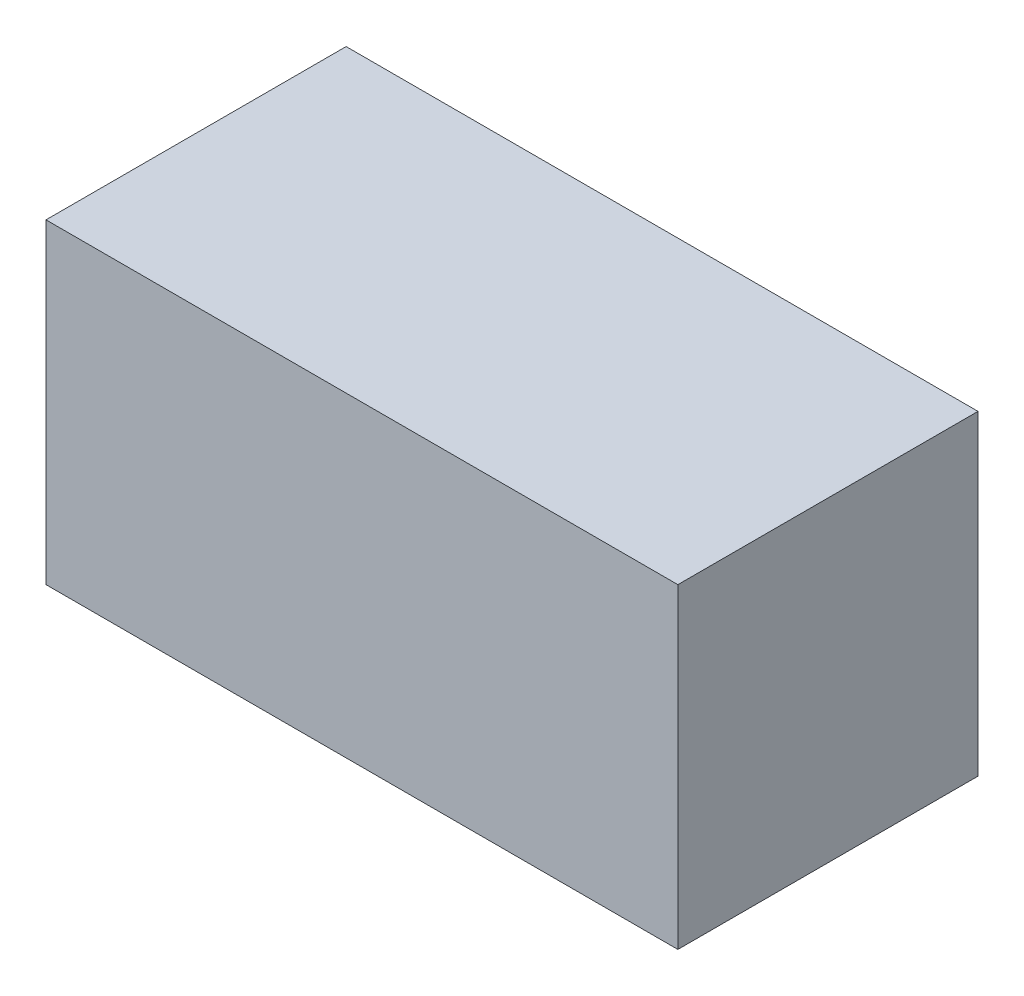
ISO-10303-21;
HEADER;
FILE_DESCRIPTION(('STEP AP214'),'2;1');
FILE_NAME('part.step','',(''),(''),'','','');
FILE_SCHEMA(('AUTOMOTIVE_DESIGN { 1 0 10303 214 1 1 1 1 }'));
ENDSEC;
DATA;
#1=APPLICATION_CONTEXT('core data for automotive mechanical design processes');
#2=APPLICATION_PROTOCOL_DEFINITION('international standard','automotive_design',2000,#1);
#3=PRODUCT_CONTEXT('',#1,'mechanical');
#4=PRODUCT('Part','Part','',(#3));
#5=PRODUCT_RELATED_PRODUCT_CATEGORY('part','',(#4));
#6=PRODUCT_DEFINITION_FORMATION('','',#4);
#7=PRODUCT_DEFINITION_CONTEXT('part definition',#1,'design');
#8=PRODUCT_DEFINITION('design','',#6,#7);
#9=PRODUCT_DEFINITION_SHAPE('','',#8);
#10=(LENGTH_UNIT() NAMED_UNIT(*) SI_UNIT(.MILLI.,.METRE.));
#11=(NAMED_UNIT(*) PLANE_ANGLE_UNIT() SI_UNIT($,.RADIAN.));
#12=(NAMED_UNIT(*) SI_UNIT($,.STERADIAN.) SOLID_ANGLE_UNIT());
#13=UNCERTAINTY_MEASURE_WITH_UNIT(LENGTH_MEASURE(1.E-05),#10,'distance_accuracy_value','');
#14=(GEOMETRIC_REPRESENTATION_CONTEXT(3) GLOBAL_UNCERTAINTY_ASSIGNED_CONTEXT((#13)) GLOBAL_UNIT_ASSIGNED_CONTEXT((#10,
#11,#12)) REPRESENTATION_CONTEXT('',''));
#15=CARTESIAN_POINT('',(0.,0.,0.));
#16=DIRECTION('',(0.,0.,1.));
#17=DIRECTION('',(1.,0.,0.));
#18=AXIS2_PLACEMENT_3D('',#15,#16,#17);
#19=CARTESIAN_POINT('',(0.,0.,-19.));
#20=DIRECTION('',(-1.,0.,0.));
#21=DIRECTION('',(0.,0.,1.));
#22=AXIS2_PLACEMENT_3D('',#19,#20,#21);
#23=PLANE('',#22);
#24=DIRECTION('',(0.,-1.,0.));
#25=VECTOR('',#24,1.);
#26=CARTESIAN_POINT('',(0.,0.,0.));
#27=LINE('',#26,#25);
#28=CARTESIAN_POINT('',(0.,20.,0.));
#29=VERTEX_POINT('',#28);
#30=CARTESIAN_POINT('',(0.,0.,0.));
#31=VERTEX_POINT('',#30);
#32=EDGE_CURVE('E107',#29,#31,#27,.T.);
#33=ORIENTED_EDGE('',*,*,#32,.F.);
#34=DIRECTION('',(0.,0.,1.));
#35=VECTOR('',#34,1.);
#36=CARTESIAN_POINT('',(0.,20.,-19.));
#37=LINE('',#36,#35);
#38=CARTESIAN_POINT('',(0.,20.,-19.));
#39=VERTEX_POINT('',#38);
#40=EDGE_CURVE('E11',#39,#29,#37,.T.);
#41=ORIENTED_EDGE('',*,*,#40,.F.);
#42=DIRECTION('',(0.,-1.,0.));
#43=VECTOR('',#42,1.);
#44=CARTESIAN_POINT('',(0.,0.,-19.));
#45=LINE('',#44,#43);
#46=CARTESIAN_POINT('',(0.,0.,-19.));
#47=VERTEX_POINT('',#46);
#48=EDGE_CURVE('E102',#39,#47,#45,.T.);
#49=ORIENTED_EDGE('',*,*,#48,.T.);
#50=DIRECTION('',(0.,0.,1.));
#51=VECTOR('',#50,1.);
#52=CARTESIAN_POINT('',(0.,0.,-19.));
#53=LINE('',#52,#51);
#54=EDGE_CURVE('E46',#47,#31,#53,.T.);
#55=ORIENTED_EDGE('',*,*,#54,.T.);
#56=EDGE_LOOP('',(#33,#41,#49,#55));
#57=FACE_BOUND('',#56,.T.);
#58=ADVANCED_FACE('F43',(#57),#23,.T.);
#59=CARTESIAN_POINT('',(0.,20.,-19.));
#60=DIRECTION('',(0.,1.,0.));
#61=DIRECTION('',(0.,0.,1.));
#62=AXIS2_PLACEMENT_3D('',#59,#60,#61);
#63=PLANE('',#62);
#64=DIRECTION('',(-1.,0.,0.));
#65=VECTOR('',#64,1.);
#66=CARTESIAN_POINT('',(0.,20.,0.));
#67=LINE('',#66,#65);
#68=CARTESIAN_POINT('',(40.,20.,0.));
#69=VERTEX_POINT('',#68);
#70=EDGE_CURVE('E104',#69,#29,#67,.T.);
#71=ORIENTED_EDGE('',*,*,#70,.F.);
#72=DIRECTION('',(0.,0.,1.));
#73=VECTOR('',#72,1.);
#74=CARTESIAN_POINT('',(40.,20.,-19.));
#75=LINE('',#74,#73);
#76=CARTESIAN_POINT('',(40.,20.,-19.));
#77=VERTEX_POINT('',#76);
#78=EDGE_CURVE('E55',#77,#69,#75,.T.);
#79=ORIENTED_EDGE('',*,*,#78,.F.);
#80=DIRECTION('',(-1.,0.,0.));
#81=VECTOR('',#80,1.);
#82=CARTESIAN_POINT('',(0.,20.,-19.));
#83=LINE('',#82,#81);
#84=EDGE_CURVE('E97',#77,#39,#83,.T.);
#85=ORIENTED_EDGE('',*,*,#84,.T.);
#86=ORIENTED_EDGE('',*,*,#40,.T.);
#87=EDGE_LOOP('',(#71,#79,#85,#86));
#88=FACE_BOUND('',#87,.T.);
#89=ADVANCED_FACE('F117',(#88),#63,.T.);
#90=CARTESIAN_POINT('',(40.,0.,-19.));
#91=DIRECTION('',(1.,0.,0.));
#92=DIRECTION('',(0.,0.,-1.));
#93=AXIS2_PLACEMENT_3D('',#90,#91,#92);
#94=PLANE('',#93);
#95=DIRECTION('',(0.,1.,0.));
#96=VECTOR('',#95,1.);
#97=CARTESIAN_POINT('',(40.,0.,0.));
#98=LINE('',#97,#96);
#99=CARTESIAN_POINT('',(40.,0.,0.));
#100=VERTEX_POINT('',#99);
#101=EDGE_CURVE('E93',#100,#69,#98,.T.);
#102=ORIENTED_EDGE('',*,*,#101,.F.);
#103=DIRECTION('',(0.,0.,1.));
#104=VECTOR('',#103,1.);
#105=CARTESIAN_POINT('',(40.,0.,-19.));
#106=LINE('',#105,#104);
#107=CARTESIAN_POINT('',(40.,0.,-19.));
#108=VERTEX_POINT('',#107);
#109=EDGE_CURVE('E88',#108,#100,#106,.T.);
#110=ORIENTED_EDGE('',*,*,#109,.F.);
#111=DIRECTION('',(0.,1.,0.));
#112=VECTOR('',#111,1.);
#113=CARTESIAN_POINT('',(40.,0.,-19.));
#114=LINE('',#113,#112);
#115=EDGE_CURVE('E91',#108,#77,#114,.T.);
#116=ORIENTED_EDGE('',*,*,#115,.T.);
#117=ORIENTED_EDGE('',*,*,#78,.T.);
#118=EDGE_LOOP('',(#102,#110,#116,#117));
#119=FACE_BOUND('',#118,.T.);
#120=ADVANCED_FACE('F89',(#119),#94,.T.);
#121=CARTESIAN_POINT('',(0.,0.,-19.));
#122=DIRECTION('',(0.,-1.,0.));
#123=DIRECTION('',(0.,0.,-1.));
#124=AXIS2_PLACEMENT_3D('',#121,#122,#123);
#125=PLANE('',#124);
#126=DIRECTION('',(1.,0.,0.));
#127=VECTOR('',#126,1.);
#128=CARTESIAN_POINT('',(0.,0.,0.));
#129=LINE('',#128,#127);
#130=EDGE_CURVE('E110',#31,#100,#129,.T.);
#131=ORIENTED_EDGE('',*,*,#130,.F.);
#132=ORIENTED_EDGE('',*,*,#54,.F.);
#133=DIRECTION('',(1.,0.,0.));
#134=VECTOR('',#133,1.);
#135=CARTESIAN_POINT('',(0.,0.,-19.));
#136=LINE('',#135,#134);
#137=EDGE_CURVE('E100',#47,#108,#136,.T.);
#138=ORIENTED_EDGE('',*,*,#137,.T.);
#139=ORIENTED_EDGE('',*,*,#109,.T.);
#140=EDGE_LOOP('',(#131,#132,#138,#139));
#141=FACE_BOUND('',#140,.T.);
#142=ADVANCED_FACE('F99',(#141),#125,.T.);
#143=CARTESIAN_POINT('',(0.,0.,-19.));
#144=DIRECTION('',(0.,0.,-1.));
#145=DIRECTION('',(-1.,0.,0.));
#146=AXIS2_PLACEMENT_3D('',#143,#144,#145);
#147=PLANE('',#146);
#148=ORIENTED_EDGE('',*,*,#48,.F.);
#149=ORIENTED_EDGE('',*,*,#84,.F.);
#150=ORIENTED_EDGE('',*,*,#115,.F.);
#151=ORIENTED_EDGE('',*,*,#137,.F.);
#152=EDGE_LOOP('',(#148,#149,#150,#151));
#153=FACE_BOUND('',#152,.T.);
#154=ADVANCED_FACE('F96',(#153),#147,.T.);
#155=CARTESIAN_POINT('',(0.,0.,0.));
#156=DIRECTION('',(0.,0.,-1.));
#157=DIRECTION('',(-1.,0.,0.));
#158=AXIS2_PLACEMENT_3D('',#155,#156,#157);
#159=PLANE('',#158);
#160=ORIENTED_EDGE('',*,*,#32,.T.);
#161=ORIENTED_EDGE('',*,*,#130,.T.);
#162=ORIENTED_EDGE('',*,*,#101,.T.);
#163=ORIENTED_EDGE('',*,*,#70,.T.);
#164=EDGE_LOOP('',(#160,#161,#162,#163));
#165=FACE_BOUND('',#164,.T.);
#166=ADVANCED_FACE('F116',(#165),#159,.F.);
#167=CLOSED_SHELL('',(#58,#89,#120,#142,#154,#166));
#168=MANIFOLD_SOLID_BREP('B2',#167);
#169=ADVANCED_BREP_SHAPE_REPRESENTATION('',(#18,#168),#14);
#170=SHAPE_DEFINITION_REPRESENTATION(#9,#169);
ENDSEC;
END-ISO-10303-21;
